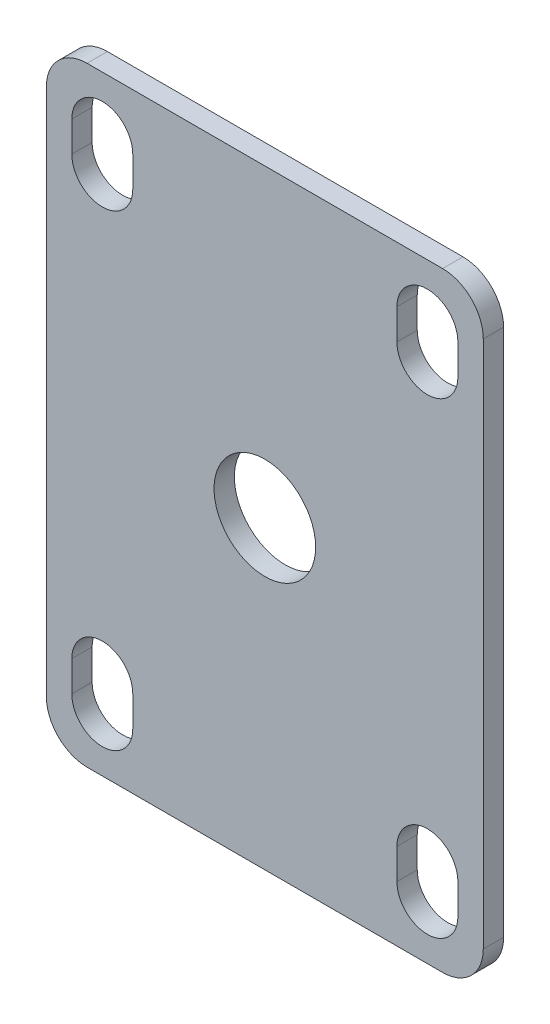
ISO-10303-21;
HEADER;
FILE_DESCRIPTION(('STEP AP214'),'2;1');
FILE_NAME('part.step','',(''),(''),'','','');
FILE_SCHEMA(('AUTOMOTIVE_DESIGN { 1 0 10303 214 1 1 1 1 }'));
ENDSEC;
DATA;
#1=APPLICATION_CONTEXT('core data for automotive mechanical design processes');
#2=APPLICATION_PROTOCOL_DEFINITION('international standard','automotive_design',2000,#1);
#3=PRODUCT_CONTEXT('',#1,'mechanical');
#4=PRODUCT('Part','Part','',(#3));
#5=PRODUCT_RELATED_PRODUCT_CATEGORY('part','',(#4));
#6=PRODUCT_DEFINITION_FORMATION('','',#4);
#7=PRODUCT_DEFINITION_CONTEXT('part definition',#1,'design');
#8=PRODUCT_DEFINITION('design','',#6,#7);
#9=PRODUCT_DEFINITION_SHAPE('','',#8);
#10=(LENGTH_UNIT() NAMED_UNIT(*) SI_UNIT(.MILLI.,.METRE.));
#11=(NAMED_UNIT(*) PLANE_ANGLE_UNIT() SI_UNIT($,.RADIAN.));
#12=(NAMED_UNIT(*) SI_UNIT($,.STERADIAN.) SOLID_ANGLE_UNIT());
#13=UNCERTAINTY_MEASURE_WITH_UNIT(LENGTH_MEASURE(1.E-05),#10,'distance_accuracy_value','');
#14=(GEOMETRIC_REPRESENTATION_CONTEXT(3) GLOBAL_UNCERTAINTY_ASSIGNED_CONTEXT((#13)) GLOBAL_UNIT_ASSIGNED_CONTEXT((#10,
#11,#12)) REPRESENTATION_CONTEXT('',''));
#15=CARTESIAN_POINT('',(0.,0.,0.));
#16=DIRECTION('',(0.,0.,1.));
#17=DIRECTION('',(1.,0.,0.));
#18=AXIS2_PLACEMENT_3D('',#15,#16,#17);
#19=CARTESIAN_POINT('',(39.,4.,2.));
#20=DIRECTION('',(0.,0.,1.));
#21=DIRECTION('',(1.,0.,0.));
#22=AXIS2_PLACEMENT_3D('',#19,#20,#21);
#23=PLANE('',#22);
#24=CARTESIAN_POINT('',(39.,4.,2.));
#25=DIRECTION('',(0.,0.,1.));
#26=DIRECTION('',(1.,0.,0.));
#27=AXIS2_PLACEMENT_3D('',#24,#25,#26);
#28=CIRCLE('',#27,4.);
#29=CARTESIAN_POINT('',(39.,0.,2.));
#30=VERTEX_POINT('',#29);
#31=CARTESIAN_POINT('',(43.,4.00000000000003,2.));
#32=VERTEX_POINT('',#31);
#33=EDGE_CURVE('E334',#30,#32,#28,.T.);
#34=ORIENTED_EDGE('',*,*,#33,.T.);
#35=DIRECTION('',(0.,1.,0.));
#36=VECTOR('',#35,1.);
#37=CARTESIAN_POINT('',(43.,4.00000000000003,2.));
#38=LINE('',#37,#36);
#39=CARTESIAN_POINT('',(43.,56.,2.));
#40=VERTEX_POINT('',#39);
#41=EDGE_CURVE('E337',#32,#40,#38,.T.);
#42=ORIENTED_EDGE('',*,*,#41,.T.);
#43=CARTESIAN_POINT('',(39.,56.,2.));
#44=DIRECTION('',(0.,0.,1.));
#45=DIRECTION('',(-1.,0.,0.));
#46=AXIS2_PLACEMENT_3D('',#43,#44,#45);
#47=CIRCLE('',#46,4.);
#48=CARTESIAN_POINT('',(39.,60.,2.));
#49=VERTEX_POINT('',#48);
#50=EDGE_CURVE('E340',#40,#49,#47,.T.);
#51=ORIENTED_EDGE('',*,*,#50,.T.);
#52=DIRECTION('',(-1.,0.,0.));
#53=VECTOR('',#52,1.);
#54=CARTESIAN_POINT('',(4.00000000000003,60.,2.));
#55=LINE('',#54,#53);
#56=CARTESIAN_POINT('',(4.00000000000003,60.,2.));
#57=VERTEX_POINT('',#56);
#58=EDGE_CURVE('E342',#49,#57,#55,.T.);
#59=ORIENTED_EDGE('',*,*,#58,.T.);
#60=CARTESIAN_POINT('',(4.,56.,2.));
#61=DIRECTION('',(0.,0.,1.));
#62=DIRECTION('',(-1.,0.,0.));
#63=AXIS2_PLACEMENT_3D('',#60,#61,#62);
#64=CIRCLE('',#63,4.);
#65=CARTESIAN_POINT('',(0.,56.,2.));
#66=VERTEX_POINT('',#65);
#67=EDGE_CURVE('E344',#57,#66,#64,.T.);
#68=ORIENTED_EDGE('',*,*,#67,.T.);
#69=DIRECTION('',(0.,-1.,0.));
#70=VECTOR('',#69,1.);
#71=CARTESIAN_POINT('',(0.,4.00000000000003,2.));
#72=LINE('',#71,#70);
#73=CARTESIAN_POINT('',(0.,4.,2.));
#74=VERTEX_POINT('',#73);
#75=EDGE_CURVE('E346',#66,#74,#72,.T.);
#76=ORIENTED_EDGE('',*,*,#75,.T.);
#77=CARTESIAN_POINT('',(4.,4.,2.));
#78=DIRECTION('',(0.,0.,1.));
#79=DIRECTION('',(-1.,0.,0.));
#80=AXIS2_PLACEMENT_3D('',#77,#78,#79);
#81=CIRCLE('',#80,4.);
#82=CARTESIAN_POINT('',(4.00000000000003,0.,2.));
#83=VERTEX_POINT('',#82);
#84=EDGE_CURVE('E348',#74,#83,#81,.T.);
#85=ORIENTED_EDGE('',*,*,#84,.T.);
#86=DIRECTION('',(1.,0.,0.));
#87=VECTOR('',#86,1.);
#88=CARTESIAN_POINT('',(4.00000000000003,0.,2.));
#89=LINE('',#88,#87);
#90=EDGE_CURVE('E350',#83,#30,#89,.T.);
#91=ORIENTED_EDGE('',*,*,#90,.T.);
#92=EDGE_LOOP('',(#34,#42,#51,#59,#68,#76,#85,#91));
#93=FACE_BOUND('',#92,.T.);
#94=CARTESIAN_POINT('',(21.5,30.,2.));
#95=DIRECTION('',(0.,0.,1.));
#96=DIRECTION('',(1.,0.,0.));
#97=AXIS2_PLACEMENT_3D('',#94,#95,#96);
#98=CIRCLE('',#97,5.);
#99=CARTESIAN_POINT('',(26.5,30.,2.));
#100=VERTEX_POINT('',#99);
#101=EDGE_CURVE('E328',#100,#100,#98,.T.);
#102=ORIENTED_EDGE('',*,*,#101,.F.);
#103=EDGE_LOOP('',(#102));
#104=FACE_BOUND('',#103,.T.);
#105=DIRECTION('',(0.,-1.,0.));
#106=VECTOR('',#105,1.);
#107=CARTESIAN_POINT('',(34.5,8.5,2.));
#108=LINE('',#107,#106);
#109=CARTESIAN_POINT('',(34.5,8.5,2.));
#110=VERTEX_POINT('',#109);
#111=CARTESIAN_POINT('',(34.5,5.5,2.));
#112=VERTEX_POINT('',#111);
#113=EDGE_CURVE('E299',#110,#112,#108,.T.);
#114=ORIENTED_EDGE('',*,*,#113,.F.);
#115=CARTESIAN_POINT('',(37.5,8.5,2.));
#116=DIRECTION('',(0.,0.,1.));
#117=DIRECTION('',(1.,0.,0.));
#118=AXIS2_PLACEMENT_3D('',#115,#116,#117);
#119=CIRCLE('',#118,3.);
#120=CARTESIAN_POINT('',(40.5,8.5,2.));
#121=VERTEX_POINT('',#120);
#122=EDGE_CURVE('E297',#121,#110,#119,.T.);
#123=ORIENTED_EDGE('',*,*,#122,.F.);
#124=DIRECTION('',(0.,1.,0.));
#125=VECTOR('',#124,1.);
#126=CARTESIAN_POINT('',(40.5,8.5,2.));
#127=LINE('',#126,#125);
#128=CARTESIAN_POINT('',(40.5,5.5,2.));
#129=VERTEX_POINT('',#128);
#130=EDGE_CURVE('E305',#129,#121,#127,.T.);
#131=ORIENTED_EDGE('',*,*,#130,.F.);
#132=CARTESIAN_POINT('',(37.5,5.5,2.));
#133=DIRECTION('',(0.,0.,1.));
#134=DIRECTION('',(1.,0.,0.));
#135=AXIS2_PLACEMENT_3D('',#132,#133,#134);
#136=CIRCLE('',#135,3.);
#137=EDGE_CURVE('E302',#112,#129,#136,.T.);
#138=ORIENTED_EDGE('',*,*,#137,.F.);
#139=EDGE_LOOP('',(#114,#123,#131,#138));
#140=FACE_BOUND('',#139,.T.);
#141=DIRECTION('',(0.,1.,0.));
#142=VECTOR('',#141,1.);
#143=CARTESIAN_POINT('',(40.5,51.5,2.));
#144=LINE('',#143,#142);
#145=CARTESIAN_POINT('',(40.5,51.5,2.));
#146=VERTEX_POINT('',#145);
#147=CARTESIAN_POINT('',(40.5,54.5,2.));
#148=VERTEX_POINT('',#147);
#149=EDGE_CURVE('E268',#146,#148,#144,.T.);
#150=ORIENTED_EDGE('',*,*,#149,.F.);
#151=CARTESIAN_POINT('',(37.5,51.5,2.));
#152=DIRECTION('',(0.,0.,1.));
#153=DIRECTION('',(-1.,0.,0.));
#154=AXIS2_PLACEMENT_3D('',#151,#152,#153);
#155=CIRCLE('',#154,3.);
#156=CARTESIAN_POINT('',(34.5,51.5,2.));
#157=VERTEX_POINT('',#156);
#158=EDGE_CURVE('E266',#157,#146,#155,.T.);
#159=ORIENTED_EDGE('',*,*,#158,.F.);
#160=DIRECTION('',(0.,-1.,0.));
#161=VECTOR('',#160,1.);
#162=CARTESIAN_POINT('',(34.5,51.5,2.));
#163=LINE('',#162,#161);
#164=CARTESIAN_POINT('',(34.5,54.5,2.));
#165=VERTEX_POINT('',#164);
#166=EDGE_CURVE('E274',#165,#157,#163,.T.);
#167=ORIENTED_EDGE('',*,*,#166,.F.);
#168=CARTESIAN_POINT('',(37.5,54.5,2.));
#169=DIRECTION('',(0.,0.,1.));
#170=DIRECTION('',(-1.,0.,0.));
#171=AXIS2_PLACEMENT_3D('',#168,#169,#170);
#172=CIRCLE('',#171,3.);
#173=EDGE_CURVE('E271',#148,#165,#172,.T.);
#174=ORIENTED_EDGE('',*,*,#173,.F.);
#175=EDGE_LOOP('',(#150,#159,#167,#174));
#176=FACE_BOUND('',#175,.T.);
#177=DIRECTION('',(0.,-1.,0.));
#178=VECTOR('',#177,1.);
#179=CARTESIAN_POINT('',(2.5,8.5,2.));
#180=LINE('',#179,#178);
#181=CARTESIAN_POINT('',(2.5,8.5,2.));
#182=VERTEX_POINT('',#181);
#183=CARTESIAN_POINT('',(2.5,5.5,2.));
#184=VERTEX_POINT('',#183);
#185=EDGE_CURVE('E237',#182,#184,#180,.T.);
#186=ORIENTED_EDGE('',*,*,#185,.F.);
#187=CARTESIAN_POINT('',(5.50000000000001,8.5,2.));
#188=DIRECTION('',(0.,0.,1.));
#189=DIRECTION('',(-1.,0.,0.));
#190=AXIS2_PLACEMENT_3D('',#187,#188,#189);
#191=CIRCLE('',#190,3.);
#192=CARTESIAN_POINT('',(8.50000000000001,8.5,2.));
#193=VERTEX_POINT('',#192);
#194=EDGE_CURVE('E235',#193,#182,#191,.T.);
#195=ORIENTED_EDGE('',*,*,#194,.F.);
#196=DIRECTION('',(0.,1.,0.));
#197=VECTOR('',#196,1.);
#198=CARTESIAN_POINT('',(8.50000000000001,8.5,2.));
#199=LINE('',#198,#197);
#200=CARTESIAN_POINT('',(8.50000000000001,5.5,2.));
#201=VERTEX_POINT('',#200);
#202=EDGE_CURVE('E243',#201,#193,#199,.T.);
#203=ORIENTED_EDGE('',*,*,#202,.F.);
#204=CARTESIAN_POINT('',(5.50000000000001,5.5,2.));
#205=DIRECTION('',(0.,0.,1.));
#206=DIRECTION('',(-1.,0.,0.));
#207=AXIS2_PLACEMENT_3D('',#204,#205,#206);
#208=CIRCLE('',#207,3.);
#209=EDGE_CURVE('E240',#184,#201,#208,.T.);
#210=ORIENTED_EDGE('',*,*,#209,.F.);
#211=EDGE_LOOP('',(#186,#195,#203,#210));
#212=FACE_BOUND('',#211,.T.);
#213=DIRECTION('',(0.,1.,0.));
#214=VECTOR('',#213,1.);
#215=CARTESIAN_POINT('',(8.50000000000001,51.5,2.));
#216=LINE('',#215,#214);
#217=CARTESIAN_POINT('',(8.50000000000001,51.5,2.));
#218=VERTEX_POINT('',#217);
#219=CARTESIAN_POINT('',(8.50000000000001,54.5,2.));
#220=VERTEX_POINT('',#219);
#221=EDGE_CURVE('E207',#218,#220,#216,.T.);
#222=ORIENTED_EDGE('',*,*,#221,.F.);
#223=CARTESIAN_POINT('',(5.50000000000001,51.5,2.));
#224=DIRECTION('',(0.,0.,1.));
#225=DIRECTION('',(1.,0.,0.));
#226=AXIS2_PLACEMENT_3D('',#223,#224,#225);
#227=CIRCLE('',#226,3.);
#228=CARTESIAN_POINT('',(2.5,51.5,2.));
#229=VERTEX_POINT('',#228);
#230=EDGE_CURVE('E199',#229,#218,#227,.T.);
#231=ORIENTED_EDGE('',*,*,#230,.F.);
#232=DIRECTION('',(0.,-1.,0.));
#233=VECTOR('',#232,1.);
#234=CARTESIAN_POINT('',(2.5,51.5,2.));
#235=LINE('',#234,#233);
#236=CARTESIAN_POINT('',(2.5,54.5,2.));
#237=VERTEX_POINT('',#236);
#238=EDGE_CURVE('E221',#237,#229,#235,.T.);
#239=ORIENTED_EDGE('',*,*,#238,.F.);
#240=CARTESIAN_POINT('',(5.50000000000001,54.5,2.));
#241=DIRECTION('',(0.,0.,1.));
#242=DIRECTION('',(1.,0.,0.));
#243=AXIS2_PLACEMENT_3D('',#240,#241,#242);
#244=CIRCLE('',#243,3.);
#245=EDGE_CURVE('E219',#220,#237,#244,.T.);
#246=ORIENTED_EDGE('',*,*,#245,.F.);
#247=EDGE_LOOP('',(#222,#231,#239,#246));
#248=FACE_BOUND('',#247,.T.);
#249=ADVANCED_FACE('F38',(#93,#104,#140,#176,#212,#248),#23,.T.);
#250=CARTESIAN_POINT('',(39.,4.,0.));
#251=DIRECTION('',(0.,0.,1.));
#252=DIRECTION('',(1.,0.,0.));
#253=AXIS2_PLACEMENT_3D('',#250,#251,#252);
#254=PLANE('',#253);
#255=CARTESIAN_POINT('',(5.50000000000001,8.5,0.));
#256=DIRECTION('',(0.,0.,1.));
#257=DIRECTION('',(-1.,0.,0.));
#258=AXIS2_PLACEMENT_3D('',#255,#256,#257);
#259=CIRCLE('',#258,3.);
#260=CARTESIAN_POINT('',(8.50000000000001,8.5,0.));
#261=VERTEX_POINT('',#260);
#262=CARTESIAN_POINT('',(2.5,8.5,0.));
#263=VERTEX_POINT('',#262);
#264=EDGE_CURVE('E215',#261,#263,#259,.T.);
#265=ORIENTED_EDGE('',*,*,#264,.T.);
#266=DIRECTION('',(0.,-1.,0.));
#267=VECTOR('',#266,1.);
#268=CARTESIAN_POINT('',(2.5,8.5,0.));
#269=LINE('',#268,#267);
#270=CARTESIAN_POINT('',(2.5,5.5,0.));
#271=VERTEX_POINT('',#270);
#272=EDGE_CURVE('E248',#263,#271,#269,.T.);
#273=ORIENTED_EDGE('',*,*,#272,.T.);
#274=CARTESIAN_POINT('',(5.50000000000001,5.5,0.));
#275=DIRECTION('',(0.,0.,1.));
#276=DIRECTION('',(-1.,0.,0.));
#277=AXIS2_PLACEMENT_3D('',#274,#275,#276);
#278=CIRCLE('',#277,3.);
#279=CARTESIAN_POINT('',(8.50000000000001,5.5,0.));
#280=VERTEX_POINT('',#279);
#281=EDGE_CURVE('E251',#271,#280,#278,.T.);
#282=ORIENTED_EDGE('',*,*,#281,.T.);
#283=DIRECTION('',(0.,1.,0.));
#284=VECTOR('',#283,1.);
#285=CARTESIAN_POINT('',(8.50000000000001,8.5,0.));
#286=LINE('',#285,#284);
#287=EDGE_CURVE('E238',#280,#261,#286,.T.);
#288=ORIENTED_EDGE('',*,*,#287,.T.);
#289=EDGE_LOOP('',(#265,#273,#282,#288));
#290=FACE_BOUND('',#289,.T.);
#291=CARTESIAN_POINT('',(37.5,8.5,0.));
#292=DIRECTION('',(0.,0.,1.));
#293=DIRECTION('',(1.,0.,0.));
#294=AXIS2_PLACEMENT_3D('',#291,#292,#293);
#295=CIRCLE('',#294,3.);
#296=CARTESIAN_POINT('',(40.5,8.5,0.));
#297=VERTEX_POINT('',#296);
#298=CARTESIAN_POINT('',(34.5,8.5,0.));
#299=VERTEX_POINT('',#298);
#300=EDGE_CURVE('E296',#297,#299,#295,.T.);
#301=ORIENTED_EDGE('',*,*,#300,.T.);
#302=DIRECTION('',(0.,-1.,0.));
#303=VECTOR('',#302,1.);
#304=CARTESIAN_POINT('',(34.5,8.5,0.));
#305=LINE('',#304,#303);
#306=CARTESIAN_POINT('',(34.5,5.5,0.));
#307=VERTEX_POINT('',#306);
#308=EDGE_CURVE('E310',#299,#307,#305,.T.);
#309=ORIENTED_EDGE('',*,*,#308,.T.);
#310=CARTESIAN_POINT('',(37.5,5.5,0.));
#311=DIRECTION('',(0.,0.,1.));
#312=DIRECTION('',(1.,0.,0.));
#313=AXIS2_PLACEMENT_3D('',#310,#311,#312);
#314=CIRCLE('',#313,3.);
#315=CARTESIAN_POINT('',(40.5,5.5,0.));
#316=VERTEX_POINT('',#315);
#317=EDGE_CURVE('E313',#307,#316,#314,.T.);
#318=ORIENTED_EDGE('',*,*,#317,.T.);
#319=DIRECTION('',(0.,1.,0.));
#320=VECTOR('',#319,1.);
#321=CARTESIAN_POINT('',(40.5,8.5,0.));
#322=LINE('',#321,#320);
#323=EDGE_CURVE('E300',#316,#297,#322,.T.);
#324=ORIENTED_EDGE('',*,*,#323,.T.);
#325=EDGE_LOOP('',(#301,#309,#318,#324));
#326=FACE_BOUND('',#325,.T.);
#327=CARTESIAN_POINT('',(39.,4.,0.));
#328=DIRECTION('',(0.,0.,1.));
#329=DIRECTION('',(1.,0.,0.));
#330=AXIS2_PLACEMENT_3D('',#327,#328,#329);
#331=CIRCLE('',#330,4.);
#332=CARTESIAN_POINT('',(39.,0.,0.));
#333=VERTEX_POINT('',#332);
#334=CARTESIAN_POINT('',(43.,4.00000000000003,0.));
#335=VERTEX_POINT('',#334);
#336=EDGE_CURVE('E331',#333,#335,#331,.T.);
#337=ORIENTED_EDGE('',*,*,#336,.F.);
#338=DIRECTION('',(1.,0.,0.));
#339=VECTOR('',#338,1.);
#340=CARTESIAN_POINT('',(4.00000000000003,0.,0.));
#341=LINE('',#340,#339);
#342=CARTESIAN_POINT('',(4.00000000000003,0.,0.));
#343=VERTEX_POINT('',#342);
#344=EDGE_CURVE('E338',#343,#333,#341,.T.);
#345=ORIENTED_EDGE('',*,*,#344,.F.);
#346=CARTESIAN_POINT('',(4.,4.,0.));
#347=DIRECTION('',(0.,0.,1.));
#348=DIRECTION('',(-1.,0.,0.));
#349=AXIS2_PLACEMENT_3D('',#346,#347,#348);
#350=CIRCLE('',#349,4.);
#351=CARTESIAN_POINT('',(0.,4.,0.));
#352=VERTEX_POINT('',#351);
#353=EDGE_CURVE('E365',#352,#343,#350,.T.);
#354=ORIENTED_EDGE('',*,*,#353,.F.);
#355=DIRECTION('',(0.,-1.,0.));
#356=VECTOR('',#355,1.);
#357=CARTESIAN_POINT('',(0.,4.00000000000003,0.));
#358=LINE('',#357,#356);
#359=CARTESIAN_POINT('',(0.,56.,0.));
#360=VERTEX_POINT('',#359);
#361=EDGE_CURVE('E363',#360,#352,#358,.T.);
#362=ORIENTED_EDGE('',*,*,#361,.F.);
#363=CARTESIAN_POINT('',(4.,56.,0.));
#364=DIRECTION('',(0.,0.,1.));
#365=DIRECTION('',(-1.,0.,0.));
#366=AXIS2_PLACEMENT_3D('',#363,#364,#365);
#367=CIRCLE('',#366,4.);
#368=CARTESIAN_POINT('',(4.00000000000003,60.,0.));
#369=VERTEX_POINT('',#368);
#370=EDGE_CURVE('E361',#369,#360,#367,.T.);
#371=ORIENTED_EDGE('',*,*,#370,.F.);
#372=DIRECTION('',(-1.,0.,0.));
#373=VECTOR('',#372,1.);
#374=CARTESIAN_POINT('',(4.00000000000003,60.,0.));
#375=LINE('',#374,#373);
#376=CARTESIAN_POINT('',(39.,60.,0.));
#377=VERTEX_POINT('',#376);
#378=EDGE_CURVE('E359',#377,#369,#375,.T.);
#379=ORIENTED_EDGE('',*,*,#378,.F.);
#380=CARTESIAN_POINT('',(39.,56.,0.));
#381=DIRECTION('',(0.,0.,1.));
#382=DIRECTION('',(-1.,0.,0.));
#383=AXIS2_PLACEMENT_3D('',#380,#381,#382);
#384=CIRCLE('',#383,4.);
#385=CARTESIAN_POINT('',(43.,56.,0.));
#386=VERTEX_POINT('',#385);
#387=EDGE_CURVE('E357',#386,#377,#384,.T.);
#388=ORIENTED_EDGE('',*,*,#387,.F.);
#389=DIRECTION('',(0.,1.,0.));
#390=VECTOR('',#389,1.);
#391=CARTESIAN_POINT('',(43.,4.00000000000003,0.));
#392=LINE('',#391,#390);
#393=EDGE_CURVE('E355',#335,#386,#392,.T.);
#394=ORIENTED_EDGE('',*,*,#393,.F.);
#395=EDGE_LOOP('',(#337,#345,#354,#362,#371,#379,#388,#394));
#396=FACE_BOUND('',#395,.T.);
#397=CARTESIAN_POINT('',(21.5,30.,0.));
#398=DIRECTION('',(0.,0.,1.));
#399=DIRECTION('',(1.,0.,0.));
#400=AXIS2_PLACEMENT_3D('',#397,#398,#399);
#401=CIRCLE('',#400,5.);
#402=CARTESIAN_POINT('',(26.5,30.,0.));
#403=VERTEX_POINT('',#402);
#404=EDGE_CURVE('E327',#403,#403,#401,.T.);
#405=ORIENTED_EDGE('',*,*,#404,.T.);
#406=EDGE_LOOP('',(#405));
#407=FACE_BOUND('',#406,.T.);
#408=CARTESIAN_POINT('',(37.5,51.5,0.));
#409=DIRECTION('',(0.,0.,1.));
#410=DIRECTION('',(-1.,0.,0.));
#411=AXIS2_PLACEMENT_3D('',#408,#409,#410);
#412=CIRCLE('',#411,3.);
#413=CARTESIAN_POINT('',(34.5,51.5,0.));
#414=VERTEX_POINT('',#413);
#415=CARTESIAN_POINT('',(40.5,51.5,0.));
#416=VERTEX_POINT('',#415);
#417=EDGE_CURVE('E265',#414,#416,#412,.T.);
#418=ORIENTED_EDGE('',*,*,#417,.T.);
#419=DIRECTION('',(0.,1.,0.));
#420=VECTOR('',#419,1.);
#421=CARTESIAN_POINT('',(40.5,51.5,0.));
#422=LINE('',#421,#420);
#423=CARTESIAN_POINT('',(40.5,54.5,0.));
#424=VERTEX_POINT('',#423);
#425=EDGE_CURVE('E279',#416,#424,#422,.T.);
#426=ORIENTED_EDGE('',*,*,#425,.T.);
#427=CARTESIAN_POINT('',(37.5,54.5,0.));
#428=DIRECTION('',(0.,0.,1.));
#429=DIRECTION('',(-1.,0.,0.));
#430=AXIS2_PLACEMENT_3D('',#427,#428,#429);
#431=CIRCLE('',#430,3.);
#432=CARTESIAN_POINT('',(34.5,54.5,0.));
#433=VERTEX_POINT('',#432);
#434=EDGE_CURVE('E282',#424,#433,#431,.T.);
#435=ORIENTED_EDGE('',*,*,#434,.T.);
#436=DIRECTION('',(0.,-1.,0.));
#437=VECTOR('',#436,1.);
#438=CARTESIAN_POINT('',(34.5,51.5,0.));
#439=LINE('',#438,#437);
#440=EDGE_CURVE('E269',#433,#414,#439,.T.);
#441=ORIENTED_EDGE('',*,*,#440,.T.);
#442=EDGE_LOOP('',(#418,#426,#435,#441));
#443=FACE_BOUND('',#442,.T.);
#444=CARTESIAN_POINT('',(5.50000000000001,51.5,0.));
#445=DIRECTION('',(0.,0.,1.));
#446=DIRECTION('',(1.,0.,0.));
#447=AXIS2_PLACEMENT_3D('',#444,#445,#446);
#448=CIRCLE('',#447,3.);
#449=CARTESIAN_POINT('',(2.5,51.5,0.));
#450=VERTEX_POINT('',#449);
#451=CARTESIAN_POINT('',(8.50000000000001,51.5,0.));
#452=VERTEX_POINT('',#451);
#453=EDGE_CURVE('E61',#450,#452,#448,.T.);
#454=ORIENTED_EDGE('',*,*,#453,.T.);
#455=DIRECTION('',(0.,1.,0.));
#456=VECTOR('',#455,1.);
#457=CARTESIAN_POINT('',(8.50000000000001,51.5,0.));
#458=LINE('',#457,#456);
#459=CARTESIAN_POINT('',(8.50000000000001,54.5,0.));
#460=VERTEX_POINT('',#459);
#461=EDGE_CURVE('E214',#452,#460,#458,.T.);
#462=ORIENTED_EDGE('',*,*,#461,.T.);
#463=CARTESIAN_POINT('',(5.50000000000001,54.5,0.));
#464=DIRECTION('',(0.,0.,1.));
#465=DIRECTION('',(1.,0.,0.));
#466=AXIS2_PLACEMENT_3D('',#463,#464,#465);
#467=CIRCLE('',#466,3.);
#468=CARTESIAN_POINT('',(2.5,54.5,0.));
#469=VERTEX_POINT('',#468);
#470=EDGE_CURVE('E227',#460,#469,#467,.T.);
#471=ORIENTED_EDGE('',*,*,#470,.T.);
#472=DIRECTION('',(0.,-1.,0.));
#473=VECTOR('',#472,1.);
#474=CARTESIAN_POINT('',(2.5,51.5,0.));
#475=LINE('',#474,#473);
#476=EDGE_CURVE('E208',#469,#450,#475,.T.);
#477=ORIENTED_EDGE('',*,*,#476,.T.);
#478=EDGE_LOOP('',(#454,#462,#471,#477));
#479=FACE_BOUND('',#478,.T.);
#480=ADVANCED_FACE('F395',(#290,#326,#396,#407,#443,#479),#254,.F.);
#481=CARTESIAN_POINT('',(39.,4.,2.));
#482=DIRECTION('',(0.,0.,-1.));
#483=DIRECTION('',(-1.,0.,0.));
#484=AXIS2_PLACEMENT_3D('',#481,#482,#483);
#485=CYLINDRICAL_SURFACE('',#484,4.);
#486=ORIENTED_EDGE('',*,*,#336,.T.);
#487=DIRECTION('',(0.,0.,-1.));
#488=VECTOR('',#487,1.);
#489=CARTESIAN_POINT('',(43.,4.00000000000003,2.));
#490=LINE('',#489,#488);
#491=EDGE_CURVE('E11',#32,#335,#490,.T.);
#492=ORIENTED_EDGE('',*,*,#491,.F.);
#493=ORIENTED_EDGE('',*,*,#33,.F.);
#494=DIRECTION('',(0.,0.,-1.));
#495=VECTOR('',#494,1.);
#496=CARTESIAN_POINT('',(39.,0.,2.));
#497=LINE('',#496,#495);
#498=EDGE_CURVE('E352',#30,#333,#497,.T.);
#499=ORIENTED_EDGE('',*,*,#498,.T.);
#500=EDGE_LOOP('',(#486,#492,#493,#499));
#501=FACE_BOUND('',#500,.T.);
#502=ADVANCED_FACE('F40',(#501),#485,.T.);
#503=CARTESIAN_POINT('',(43.,4.00000000000003,2.));
#504=DIRECTION('',(-1.,0.,0.));
#505=DIRECTION('',(0.,0.,1.));
#506=AXIS2_PLACEMENT_3D('',#503,#504,#505);
#507=PLANE('',#506);
#508=ORIENTED_EDGE('',*,*,#393,.T.);
#509=DIRECTION('',(0.,0.,-1.));
#510=VECTOR('',#509,1.);
#511=CARTESIAN_POINT('',(43.,56.,2.));
#512=LINE('',#511,#510);
#513=EDGE_CURVE('E46',#40,#386,#512,.T.);
#514=ORIENTED_EDGE('',*,*,#513,.F.);
#515=ORIENTED_EDGE('',*,*,#41,.F.);
#516=ORIENTED_EDGE('',*,*,#491,.T.);
#517=EDGE_LOOP('',(#508,#514,#515,#516));
#518=FACE_BOUND('',#517,.T.);
#519=ADVANCED_FACE('F413',(#518),#507,.F.);
#520=CARTESIAN_POINT('',(39.,56.,2.));
#521=DIRECTION('',(0.,0.,-1.));
#522=DIRECTION('',(-1.,0.,0.));
#523=AXIS2_PLACEMENT_3D('',#520,#521,#522);
#524=CYLINDRICAL_SURFACE('',#523,4.);
#525=ORIENTED_EDGE('',*,*,#387,.T.);
#526=DIRECTION('',(0.,0.,-1.));
#527=VECTOR('',#526,1.);
#528=CARTESIAN_POINT('',(39.,60.,2.));
#529=LINE('',#528,#527);
#530=EDGE_CURVE('E382',#49,#377,#529,.T.);
#531=ORIENTED_EDGE('',*,*,#530,.F.);
#532=ORIENTED_EDGE('',*,*,#50,.F.);
#533=ORIENTED_EDGE('',*,*,#513,.T.);
#534=EDGE_LOOP('',(#525,#531,#532,#533));
#535=FACE_BOUND('',#534,.T.);
#536=ADVANCED_FACE('F389',(#535),#524,.T.);
#537=CARTESIAN_POINT('',(4.00000000000003,60.,2.));
#538=DIRECTION('',(0.,-1.,0.));
#539=DIRECTION('',(0.,0.,-1.));
#540=AXIS2_PLACEMENT_3D('',#537,#538,#539);
#541=PLANE('',#540);
#542=ORIENTED_EDGE('',*,*,#378,.T.);
#543=DIRECTION('',(0.,0.,-1.));
#544=VECTOR('',#543,1.);
#545=CARTESIAN_POINT('',(4.00000000000003,60.,2.));
#546=LINE('',#545,#544);
#547=EDGE_CURVE('E379',#57,#369,#546,.T.);
#548=ORIENTED_EDGE('',*,*,#547,.F.);
#549=ORIENTED_EDGE('',*,*,#58,.F.);
#550=ORIENTED_EDGE('',*,*,#530,.T.);
#551=EDGE_LOOP('',(#542,#548,#549,#550));
#552=FACE_BOUND('',#551,.T.);
#553=ADVANCED_FACE('F401',(#552),#541,.F.);
#554=CARTESIAN_POINT('',(4.,56.,2.));
#555=DIRECTION('',(0.,0.,-1.));
#556=DIRECTION('',(-1.,0.,0.));
#557=AXIS2_PLACEMENT_3D('',#554,#555,#556);
#558=CYLINDRICAL_SURFACE('',#557,4.);
#559=ORIENTED_EDGE('',*,*,#370,.T.);
#560=DIRECTION('',(0.,0.,-1.));
#561=VECTOR('',#560,1.);
#562=CARTESIAN_POINT('',(0.,56.,2.));
#563=LINE('',#562,#561);
#564=EDGE_CURVE('E376',#66,#360,#563,.T.);
#565=ORIENTED_EDGE('',*,*,#564,.F.);
#566=ORIENTED_EDGE('',*,*,#67,.F.);
#567=ORIENTED_EDGE('',*,*,#547,.T.);
#568=EDGE_LOOP('',(#559,#565,#566,#567));
#569=FACE_BOUND('',#568,.T.);
#570=ADVANCED_FACE('F405',(#569),#558,.T.);
#571=CARTESIAN_POINT('',(0.,4.00000000000003,2.));
#572=DIRECTION('',(1.,0.,0.));
#573=DIRECTION('',(0.,0.,-1.));
#574=AXIS2_PLACEMENT_3D('',#571,#572,#573);
#575=PLANE('',#574);
#576=ORIENTED_EDGE('',*,*,#361,.T.);
#577=DIRECTION('',(0.,0.,-1.));
#578=VECTOR('',#577,1.);
#579=CARTESIAN_POINT('',(0.,4.,2.));
#580=LINE('',#579,#578);
#581=EDGE_CURVE('E373',#74,#352,#580,.T.);
#582=ORIENTED_EDGE('',*,*,#581,.F.);
#583=ORIENTED_EDGE('',*,*,#75,.F.);
#584=ORIENTED_EDGE('',*,*,#564,.T.);
#585=EDGE_LOOP('',(#576,#582,#583,#584));
#586=FACE_BOUND('',#585,.T.);
#587=ADVANCED_FACE('F426',(#586),#575,.F.);
#588=CARTESIAN_POINT('',(4.,4.,2.));
#589=DIRECTION('',(0.,0.,-1.));
#590=DIRECTION('',(-1.,0.,0.));
#591=AXIS2_PLACEMENT_3D('',#588,#589,#590);
#592=CYLINDRICAL_SURFACE('',#591,4.);
#593=ORIENTED_EDGE('',*,*,#353,.T.);
#594=DIRECTION('',(0.,0.,-1.));
#595=VECTOR('',#594,1.);
#596=CARTESIAN_POINT('',(4.00000000000003,0.,2.));
#597=LINE('',#596,#595);
#598=EDGE_CURVE('E370',#83,#343,#597,.T.);
#599=ORIENTED_EDGE('',*,*,#598,.F.);
#600=ORIENTED_EDGE('',*,*,#84,.F.);
#601=ORIENTED_EDGE('',*,*,#581,.T.);
#602=EDGE_LOOP('',(#593,#599,#600,#601));
#603=FACE_BOUND('',#602,.T.);
#604=ADVANCED_FACE('F424',(#603),#592,.T.);
#605=CARTESIAN_POINT('',(4.00000000000003,0.,2.));
#606=DIRECTION('',(0.,1.,0.));
#607=DIRECTION('',(0.,0.,1.));
#608=AXIS2_PLACEMENT_3D('',#605,#606,#607);
#609=PLANE('',#608);
#610=ORIENTED_EDGE('',*,*,#344,.T.);
#611=ORIENTED_EDGE('',*,*,#498,.F.);
#612=ORIENTED_EDGE('',*,*,#90,.F.);
#613=ORIENTED_EDGE('',*,*,#598,.T.);
#614=EDGE_LOOP('',(#610,#611,#612,#613));
#615=FACE_BOUND('',#614,.T.);
#616=ADVANCED_FACE('F419',(#615),#609,.F.);
#617=CARTESIAN_POINT('',(21.5,30.,2.));
#618=DIRECTION('',(0.,0.,-1.));
#619=DIRECTION('',(-1.,0.,0.));
#620=AXIS2_PLACEMENT_3D('',#617,#618,#619);
#621=CYLINDRICAL_SURFACE('',#620,5.);
#622=ORIENTED_EDGE('',*,*,#101,.T.);
#623=EDGE_LOOP('',(#622));
#624=FACE_BOUND('',#623,.T.);
#625=ORIENTED_EDGE('',*,*,#404,.F.);
#626=EDGE_LOOP('',(#625));
#627=FACE_BOUND('',#626,.T.);
#628=ADVANCED_FACE('F443',(#624,#627),#621,.F.);
#629=CARTESIAN_POINT('',(37.5,8.5,2.));
#630=DIRECTION('',(0.,0.,-1.));
#631=DIRECTION('',(-1.,0.,0.));
#632=AXIS2_PLACEMENT_3D('',#629,#630,#631);
#633=CYLINDRICAL_SURFACE('',#632,3.);
#634=ORIENTED_EDGE('',*,*,#300,.F.);
#635=DIRECTION('',(0.,0.,-1.));
#636=VECTOR('',#635,1.);
#637=CARTESIAN_POINT('',(40.5,8.5,2.));
#638=LINE('',#637,#636);
#639=EDGE_CURVE('E307',#121,#297,#638,.T.);
#640=ORIENTED_EDGE('',*,*,#639,.F.);
#641=ORIENTED_EDGE('',*,*,#122,.T.);
#642=DIRECTION('',(0.,0.,-1.));
#643=VECTOR('',#642,1.);
#644=CARTESIAN_POINT('',(34.5,8.5,2.));
#645=LINE('',#644,#643);
#646=EDGE_CURVE('E324',#110,#299,#645,.T.);
#647=ORIENTED_EDGE('',*,*,#646,.T.);
#648=EDGE_LOOP('',(#634,#640,#641,#647));
#649=FACE_BOUND('',#648,.T.);
#650=ADVANCED_FACE('F450',(#649),#633,.F.);
#651=CARTESIAN_POINT('',(34.5,8.5,2.));
#652=DIRECTION('',(1.,0.,0.));
#653=DIRECTION('',(0.,0.,-1.));
#654=AXIS2_PLACEMENT_3D('',#651,#652,#653);
#655=PLANE('',#654);
#656=ORIENTED_EDGE('',*,*,#308,.F.);
#657=ORIENTED_EDGE('',*,*,#646,.F.);
#658=ORIENTED_EDGE('',*,*,#113,.T.);
#659=DIRECTION('',(0.,0.,-1.));
#660=VECTOR('',#659,1.);
#661=CARTESIAN_POINT('',(34.5,5.5,2.));
#662=LINE('',#661,#660);
#663=EDGE_CURVE('E322',#112,#307,#662,.T.);
#664=ORIENTED_EDGE('',*,*,#663,.T.);
#665=EDGE_LOOP('',(#656,#657,#658,#664));
#666=FACE_BOUND('',#665,.T.);
#667=ADVANCED_FACE('F455',(#666),#655,.T.);
#668=CARTESIAN_POINT('',(37.5,5.5,2.));
#669=DIRECTION('',(0.,0.,-1.));
#670=DIRECTION('',(-1.,0.,0.));
#671=AXIS2_PLACEMENT_3D('',#668,#669,#670);
#672=CYLINDRICAL_SURFACE('',#671,3.);
#673=ORIENTED_EDGE('',*,*,#317,.F.);
#674=ORIENTED_EDGE('',*,*,#663,.F.);
#675=ORIENTED_EDGE('',*,*,#137,.T.);
#676=DIRECTION('',(0.,0.,-1.));
#677=VECTOR('',#676,1.);
#678=CARTESIAN_POINT('',(40.5,5.5,2.));
#679=LINE('',#678,#677);
#680=EDGE_CURVE('E320',#129,#316,#679,.T.);
#681=ORIENTED_EDGE('',*,*,#680,.T.);
#682=EDGE_LOOP('',(#673,#674,#675,#681));
#683=FACE_BOUND('',#682,.T.);
#684=ADVANCED_FACE('F512',(#683),#672,.F.);
#685=CARTESIAN_POINT('',(40.5,8.5,2.));
#686=DIRECTION('',(-1.,0.,0.));
#687=DIRECTION('',(0.,0.,1.));
#688=AXIS2_PLACEMENT_3D('',#685,#686,#687);
#689=PLANE('',#688);
#690=ORIENTED_EDGE('',*,*,#323,.F.);
#691=ORIENTED_EDGE('',*,*,#680,.F.);
#692=ORIENTED_EDGE('',*,*,#130,.T.);
#693=ORIENTED_EDGE('',*,*,#639,.T.);
#694=EDGE_LOOP('',(#690,#691,#692,#693));
#695=FACE_BOUND('',#694,.T.);
#696=ADVANCED_FACE('F508',(#695),#689,.T.);
#697=CARTESIAN_POINT('',(37.5,51.5,2.));
#698=DIRECTION('',(0.,0.,-1.));
#699=DIRECTION('',(-1.,0.,0.));
#700=AXIS2_PLACEMENT_3D('',#697,#698,#699);
#701=CYLINDRICAL_SURFACE('',#700,3.);
#702=ORIENTED_EDGE('',*,*,#417,.F.);
#703=DIRECTION('',(0.,0.,-1.));
#704=VECTOR('',#703,1.);
#705=CARTESIAN_POINT('',(34.5,51.5,2.));
#706=LINE('',#705,#704);
#707=EDGE_CURVE('E276',#157,#414,#706,.T.);
#708=ORIENTED_EDGE('',*,*,#707,.F.);
#709=ORIENTED_EDGE('',*,*,#158,.T.);
#710=DIRECTION('',(0.,0.,-1.));
#711=VECTOR('',#710,1.);
#712=CARTESIAN_POINT('',(40.5,51.5,2.));
#713=LINE('',#712,#711);
#714=EDGE_CURVE('E293',#146,#416,#713,.T.);
#715=ORIENTED_EDGE('',*,*,#714,.T.);
#716=EDGE_LOOP('',(#702,#708,#709,#715));
#717=FACE_BOUND('',#716,.T.);
#718=ADVANCED_FACE('F504',(#717),#701,.F.);
#719=CARTESIAN_POINT('',(40.5,51.5,2.));
#720=DIRECTION('',(-1.,0.,0.));
#721=DIRECTION('',(0.,0.,1.));
#722=AXIS2_PLACEMENT_3D('',#719,#720,#721);
#723=PLANE('',#722);
#724=ORIENTED_EDGE('',*,*,#425,.F.);
#725=ORIENTED_EDGE('',*,*,#714,.F.);
#726=ORIENTED_EDGE('',*,*,#149,.T.);
#727=DIRECTION('',(0.,0.,-1.));
#728=VECTOR('',#727,1.);
#729=CARTESIAN_POINT('',(40.5,54.5,2.));
#730=LINE('',#729,#728);
#731=EDGE_CURVE('E291',#148,#424,#730,.T.);
#732=ORIENTED_EDGE('',*,*,#731,.T.);
#733=EDGE_LOOP('',(#724,#725,#726,#732));
#734=FACE_BOUND('',#733,.T.);
#735=ADVANCED_FACE('F500',(#734),#723,.T.);
#736=CARTESIAN_POINT('',(37.5,54.5,2.));
#737=DIRECTION('',(0.,0.,-1.));
#738=DIRECTION('',(-1.,0.,0.));
#739=AXIS2_PLACEMENT_3D('',#736,#737,#738);
#740=CYLINDRICAL_SURFACE('',#739,3.);
#741=ORIENTED_EDGE('',*,*,#434,.F.);
#742=ORIENTED_EDGE('',*,*,#731,.F.);
#743=ORIENTED_EDGE('',*,*,#173,.T.);
#744=DIRECTION('',(0.,0.,-1.));
#745=VECTOR('',#744,1.);
#746=CARTESIAN_POINT('',(34.5,54.5,2.));
#747=LINE('',#746,#745);
#748=EDGE_CURVE('E289',#165,#433,#747,.T.);
#749=ORIENTED_EDGE('',*,*,#748,.T.);
#750=EDGE_LOOP('',(#741,#742,#743,#749));
#751=FACE_BOUND('',#750,.T.);
#752=ADVANCED_FACE('F496',(#751),#740,.F.);
#753=CARTESIAN_POINT('',(34.5,51.5,2.));
#754=DIRECTION('',(1.,0.,0.));
#755=DIRECTION('',(0.,0.,-1.));
#756=AXIS2_PLACEMENT_3D('',#753,#754,#755);
#757=PLANE('',#756);
#758=ORIENTED_EDGE('',*,*,#440,.F.);
#759=ORIENTED_EDGE('',*,*,#748,.F.);
#760=ORIENTED_EDGE('',*,*,#166,.T.);
#761=ORIENTED_EDGE('',*,*,#707,.T.);
#762=EDGE_LOOP('',(#758,#759,#760,#761));
#763=FACE_BOUND('',#762,.T.);
#764=ADVANCED_FACE('F492',(#763),#757,.T.);
#765=CARTESIAN_POINT('',(5.50000000000001,8.5,2.));
#766=DIRECTION('',(0.,0.,-1.));
#767=DIRECTION('',(-1.,0.,0.));
#768=AXIS2_PLACEMENT_3D('',#765,#766,#767);
#769=CYLINDRICAL_SURFACE('',#768,3.);
#770=ORIENTED_EDGE('',*,*,#264,.F.);
#771=DIRECTION('',(0.,0.,-1.));
#772=VECTOR('',#771,1.);
#773=CARTESIAN_POINT('',(8.50000000000001,8.5,2.));
#774=LINE('',#773,#772);
#775=EDGE_CURVE('E245',#193,#261,#774,.T.);
#776=ORIENTED_EDGE('',*,*,#775,.F.);
#777=ORIENTED_EDGE('',*,*,#194,.T.);
#778=DIRECTION('',(0.,0.,-1.));
#779=VECTOR('',#778,1.);
#780=CARTESIAN_POINT('',(2.5,8.5,2.));
#781=LINE('',#780,#779);
#782=EDGE_CURVE('E262',#182,#263,#781,.T.);
#783=ORIENTED_EDGE('',*,*,#782,.T.);
#784=EDGE_LOOP('',(#770,#776,#777,#783));
#785=FACE_BOUND('',#784,.T.);
#786=ADVANCED_FACE('F488',(#785),#769,.F.);
#787=CARTESIAN_POINT('',(2.5,8.5,2.));
#788=DIRECTION('',(1.,0.,0.));
#789=DIRECTION('',(0.,0.,-1.));
#790=AXIS2_PLACEMENT_3D('',#787,#788,#789);
#791=PLANE('',#790);
#792=ORIENTED_EDGE('',*,*,#272,.F.);
#793=ORIENTED_EDGE('',*,*,#782,.F.);
#794=ORIENTED_EDGE('',*,*,#185,.T.);
#795=DIRECTION('',(0.,0.,-1.));
#796=VECTOR('',#795,1.);
#797=CARTESIAN_POINT('',(2.5,5.5,2.));
#798=LINE('',#797,#796);
#799=EDGE_CURVE('E260',#184,#271,#798,.T.);
#800=ORIENTED_EDGE('',*,*,#799,.T.);
#801=EDGE_LOOP('',(#792,#793,#794,#800));
#802=FACE_BOUND('',#801,.T.);
#803=ADVANCED_FACE('F484',(#802),#791,.T.);
#804=CARTESIAN_POINT('',(5.50000000000001,5.5,2.));
#805=DIRECTION('',(0.,0.,-1.));
#806=DIRECTION('',(-1.,0.,0.));
#807=AXIS2_PLACEMENT_3D('',#804,#805,#806);
#808=CYLINDRICAL_SURFACE('',#807,3.);
#809=ORIENTED_EDGE('',*,*,#281,.F.);
#810=ORIENTED_EDGE('',*,*,#799,.F.);
#811=ORIENTED_EDGE('',*,*,#209,.T.);
#812=DIRECTION('',(0.,0.,-1.));
#813=VECTOR('',#812,1.);
#814=CARTESIAN_POINT('',(8.50000000000001,5.5,2.));
#815=LINE('',#814,#813);
#816=EDGE_CURVE('E258',#201,#280,#815,.T.);
#817=ORIENTED_EDGE('',*,*,#816,.T.);
#818=EDGE_LOOP('',(#809,#810,#811,#817));
#819=FACE_BOUND('',#818,.T.);
#820=ADVANCED_FACE('F480',(#819),#808,.F.);
#821=CARTESIAN_POINT('',(8.50000000000001,8.5,2.));
#822=DIRECTION('',(-1.,0.,0.));
#823=DIRECTION('',(0.,0.,1.));
#824=AXIS2_PLACEMENT_3D('',#821,#822,#823);
#825=PLANE('',#824);
#826=ORIENTED_EDGE('',*,*,#287,.F.);
#827=ORIENTED_EDGE('',*,*,#816,.F.);
#828=ORIENTED_EDGE('',*,*,#202,.T.);
#829=ORIENTED_EDGE('',*,*,#775,.T.);
#830=EDGE_LOOP('',(#826,#827,#828,#829));
#831=FACE_BOUND('',#830,.T.);
#832=ADVANCED_FACE('F477',(#831),#825,.T.);
#833=CARTESIAN_POINT('',(5.50000000000001,51.5,2.));
#834=DIRECTION('',(0.,0.,-1.));
#835=DIRECTION('',(-1.,0.,0.));
#836=AXIS2_PLACEMENT_3D('',#833,#834,#835);
#837=CYLINDRICAL_SURFACE('',#836,3.);
#838=ORIENTED_EDGE('',*,*,#453,.F.);
#839=DIRECTION('',(0.,0.,-1.));
#840=VECTOR('',#839,1.);
#841=CARTESIAN_POINT('',(2.5,51.5,2.));
#842=LINE('',#841,#840);
#843=EDGE_CURVE('E203',#229,#450,#842,.T.);
#844=ORIENTED_EDGE('',*,*,#843,.F.);
#845=ORIENTED_EDGE('',*,*,#230,.T.);
#846=DIRECTION('',(0.,0.,-1.));
#847=VECTOR('',#846,1.);
#848=CARTESIAN_POINT('',(8.50000000000001,51.5,2.));
#849=LINE('',#848,#847);
#850=EDGE_CURVE('E202',#218,#452,#849,.T.);
#851=ORIENTED_EDGE('',*,*,#850,.T.);
#852=EDGE_LOOP('',(#838,#844,#845,#851));
#853=FACE_BOUND('',#852,.T.);
#854=ADVANCED_FACE('F201',(#853),#837,.F.);
#855=CARTESIAN_POINT('',(8.50000000000001,51.5,2.));
#856=DIRECTION('',(-1.,0.,0.));
#857=DIRECTION('',(0.,0.,1.));
#858=AXIS2_PLACEMENT_3D('',#855,#856,#857);
#859=PLANE('',#858);
#860=ORIENTED_EDGE('',*,*,#461,.F.);
#861=ORIENTED_EDGE('',*,*,#850,.F.);
#862=ORIENTED_EDGE('',*,*,#221,.T.);
#863=DIRECTION('',(0.,0.,-1.));
#864=VECTOR('',#863,1.);
#865=CARTESIAN_POINT('',(8.50000000000001,54.5,2.));
#866=LINE('',#865,#864);
#867=EDGE_CURVE('E216',#220,#460,#866,.T.);
#868=ORIENTED_EDGE('',*,*,#867,.T.);
#869=EDGE_LOOP('',(#860,#861,#862,#868));
#870=FACE_BOUND('',#869,.T.);
#871=ADVANCED_FACE('F211',(#870),#859,.T.);
#872=CARTESIAN_POINT('',(5.50000000000001,54.5,2.));
#873=DIRECTION('',(0.,0.,-1.));
#874=DIRECTION('',(-1.,0.,0.));
#875=AXIS2_PLACEMENT_3D('',#872,#873,#874);
#876=CYLINDRICAL_SURFACE('',#875,3.);
#877=ORIENTED_EDGE('',*,*,#470,.F.);
#878=ORIENTED_EDGE('',*,*,#867,.F.);
#879=ORIENTED_EDGE('',*,*,#245,.T.);
#880=DIRECTION('',(0.,0.,-1.));
#881=VECTOR('',#880,1.);
#882=CARTESIAN_POINT('',(2.5,54.5,2.));
#883=LINE('',#882,#881);
#884=EDGE_CURVE('E53',#237,#469,#883,.T.);
#885=ORIENTED_EDGE('',*,*,#884,.T.);
#886=EDGE_LOOP('',(#877,#878,#879,#885));
#887=FACE_BOUND('',#886,.T.);
#888=ADVANCED_FACE('F465',(#887),#876,.F.);
#889=CARTESIAN_POINT('',(2.5,51.5,2.));
#890=DIRECTION('',(1.,0.,0.));
#891=DIRECTION('',(0.,0.,-1.));
#892=AXIS2_PLACEMENT_3D('',#889,#890,#891);
#893=PLANE('',#892);
#894=ORIENTED_EDGE('',*,*,#476,.F.);
#895=ORIENTED_EDGE('',*,*,#884,.F.);
#896=ORIENTED_EDGE('',*,*,#238,.T.);
#897=ORIENTED_EDGE('',*,*,#843,.T.);
#898=EDGE_LOOP('',(#894,#895,#896,#897));
#899=FACE_BOUND('',#898,.T.);
#900=ADVANCED_FACE('F463',(#899),#893,.T.);
#901=CLOSED_SHELL('',(#249,#480,#502,#519,#536,#553,#570,#587,#604,#616,#628,#650,#667,#684,
#696,#718,#735,#752,#764,#786,#803,#820,#832,#854,#871,#888,#900));
#902=MANIFOLD_SOLID_BREP('B2',#901);
#903=ADVANCED_BREP_SHAPE_REPRESENTATION('',(#18,#902),#14);
#904=SHAPE_DEFINITION_REPRESENTATION(#9,#903);
ENDSEC;
END-ISO-10303-21;
